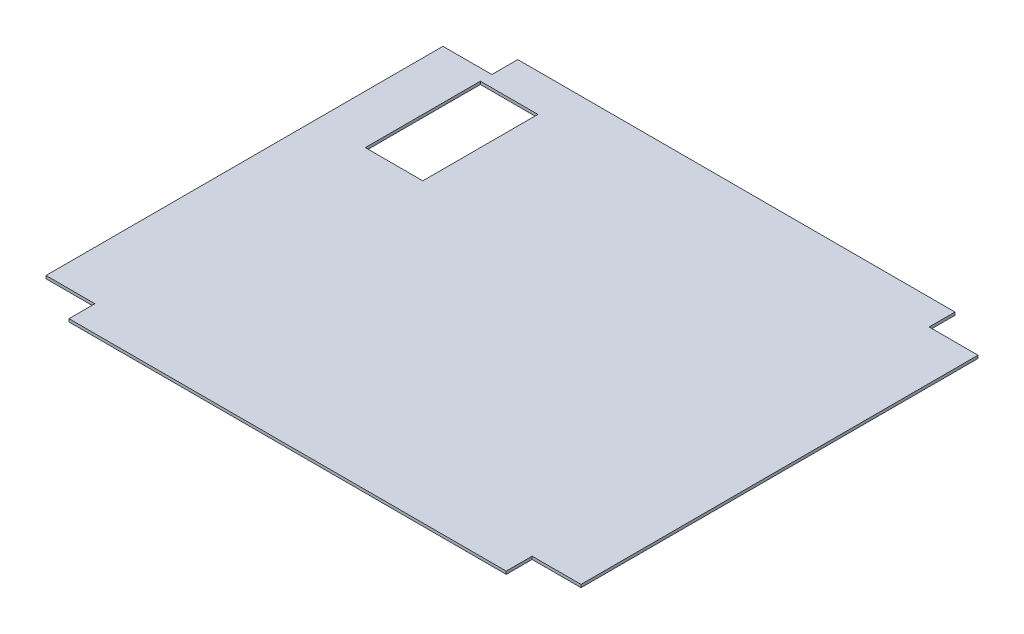
ISO-10303-21;
HEADER;
FILE_DESCRIPTION(('STEP AP214'),'2;1');
FILE_NAME('part.step','',(''),(''),'','','');
FILE_SCHEMA(('AUTOMOTIVE_DESIGN { 1 0 10303 214 1 1 1 1 }'));
ENDSEC;
DATA;
#1=APPLICATION_CONTEXT('core data for automotive mechanical design processes');
#2=APPLICATION_PROTOCOL_DEFINITION('international standard','automotive_design',2000,#1);
#3=PRODUCT_CONTEXT('',#1,'mechanical');
#4=PRODUCT('Part','Part','',(#3));
#5=PRODUCT_RELATED_PRODUCT_CATEGORY('part','',(#4));
#6=PRODUCT_DEFINITION_FORMATION('','',#4);
#7=PRODUCT_DEFINITION_CONTEXT('part definition',#1,'design');
#8=PRODUCT_DEFINITION('design','',#6,#7);
#9=PRODUCT_DEFINITION_SHAPE('','',#8);
#10=(LENGTH_UNIT() NAMED_UNIT(*) SI_UNIT(.MILLI.,.METRE.));
#11=(NAMED_UNIT(*) PLANE_ANGLE_UNIT() SI_UNIT($,.RADIAN.));
#12=(NAMED_UNIT(*) SI_UNIT($,.STERADIAN.) SOLID_ANGLE_UNIT());
#13=UNCERTAINTY_MEASURE_WITH_UNIT(LENGTH_MEASURE(1.E-05),#10,'distance_accuracy_value','');
#14=(GEOMETRIC_REPRESENTATION_CONTEXT(3) GLOBAL_UNCERTAINTY_ASSIGNED_CONTEXT((#13)) GLOBAL_UNIT_ASSIGNED_CONTEXT((#10,
#11,#12)) REPRESENTATION_CONTEXT('',''));
#15=CARTESIAN_POINT('',(0.,0.,0.));
#16=DIRECTION('',(0.,0.,1.));
#17=DIRECTION('',(1.,0.,0.));
#18=AXIS2_PLACEMENT_3D('',#15,#16,#17);
#19=CARTESIAN_POINT('',(465.,-5.,390.));
#20=DIRECTION('',(1.,0.,0.));
#21=DIRECTION('',(0.,0.,-1.));
#22=AXIS2_PLACEMENT_3D('',#19,#20,#21);
#23=PLANE('',#22);
#24=DIRECTION('',(0.,1.,0.));
#25=VECTOR('',#24,1.);
#26=CARTESIAN_POINT('',(465.,-5.,345.));
#27=LINE('',#26,#25);
#28=CARTESIAN_POINT('',(465.,-5.,345.));
#29=VERTEX_POINT('',#28);
#30=CARTESIAN_POINT('',(465.,0.,345.));
#31=VERTEX_POINT('',#30);
#32=EDGE_CURVE('E190',#29,#31,#27,.T.);
#33=ORIENTED_EDGE('',*,*,#32,.F.);
#34=DIRECTION('',(0.,0.,-1.));
#35=VECTOR('',#34,1.);
#36=CARTESIAN_POINT('',(465.,-5.,390.));
#37=LINE('',#36,#35);
#38=CARTESIAN_POINT('',(465.,-5.,-345.));
#39=VERTEX_POINT('',#38);
#40=EDGE_CURVE('E240',#29,#39,#37,.T.);
#41=ORIENTED_EDGE('',*,*,#40,.T.);
#42=DIRECTION('',(0.,1.,0.));
#43=VECTOR('',#42,1.);
#44=CARTESIAN_POINT('',(465.,-5.,-345.));
#45=LINE('',#44,#43);
#46=CARTESIAN_POINT('',(465.,0.,-345.));
#47=VERTEX_POINT('',#46);
#48=EDGE_CURVE('E214',#39,#47,#45,.T.);
#49=ORIENTED_EDGE('',*,*,#48,.T.);
#50=DIRECTION('',(0.,0.,-1.));
#51=VECTOR('',#50,1.);
#52=CARTESIAN_POINT('',(465.,0.,390.));
#53=LINE('',#52,#51);
#54=EDGE_CURVE('E236',#31,#47,#53,.T.);
#55=ORIENTED_EDGE('',*,*,#54,.F.);
#56=EDGE_LOOP('',(#33,#41,#49,#55));
#57=FACE_BOUND('',#56,.T.);
#58=ADVANCED_FACE('F17',(#57),#23,.T.);
#59=CARTESIAN_POINT('',(-465.,-5.,390.));
#60=DIRECTION('',(0.,0.,1.));
#61=DIRECTION('',(1.,0.,0.));
#62=AXIS2_PLACEMENT_3D('',#59,#60,#61);
#63=PLANE('',#62);
#64=DIRECTION('',(0.,1.,0.));
#65=VECTOR('',#64,1.);
#66=CARTESIAN_POINT('',(-380.,-5.,390.));
#67=LINE('',#66,#65);
#68=CARTESIAN_POINT('',(-380.,-5.,390.));
#69=VERTEX_POINT('',#68);
#70=CARTESIAN_POINT('',(-380.,0.,390.));
#71=VERTEX_POINT('',#70);
#72=EDGE_CURVE('E172',#69,#71,#67,.T.);
#73=ORIENTED_EDGE('',*,*,#72,.F.);
#74=DIRECTION('',(1.,0.,0.));
#75=VECTOR('',#74,1.);
#76=CARTESIAN_POINT('',(-465.,-5.,390.));
#77=LINE('',#76,#75);
#78=CARTESIAN_POINT('',(380.,-5.,390.));
#79=VERTEX_POINT('',#78);
#80=EDGE_CURVE('E11',#69,#79,#77,.T.);
#81=ORIENTED_EDGE('',*,*,#80,.T.);
#82=DIRECTION('',(0.,1.,0.));
#83=VECTOR('',#82,1.);
#84=CARTESIAN_POINT('',(380.,-5.,390.));
#85=LINE('',#84,#83);
#86=CARTESIAN_POINT('',(380.,0.,390.));
#87=VERTEX_POINT('',#86);
#88=EDGE_CURVE('E195',#79,#87,#85,.T.);
#89=ORIENTED_EDGE('',*,*,#88,.T.);
#90=DIRECTION('',(1.,0.,0.));
#91=VECTOR('',#90,1.);
#92=CARTESIAN_POINT('',(-465.,0.,390.));
#93=LINE('',#92,#91);
#94=EDGE_CURVE('E20',#71,#87,#93,.T.);
#95=ORIENTED_EDGE('',*,*,#94,.F.);
#96=EDGE_LOOP('',(#73,#81,#89,#95));
#97=FACE_BOUND('',#96,.T.);
#98=ADVANCED_FACE('F265',(#97),#63,.T.);
#99=CARTESIAN_POINT('',(-465.,-5.,390.));
#100=DIRECTION('',(-1.,0.,0.));
#101=DIRECTION('',(0.,0.,1.));
#102=AXIS2_PLACEMENT_3D('',#99,#100,#101);
#103=PLANE('',#102);
#104=DIRECTION('',(0.,1.,0.));
#105=VECTOR('',#104,1.);
#106=CARTESIAN_POINT('',(-465.,-5.,345.));
#107=LINE('',#106,#105);
#108=CARTESIAN_POINT('',(-465.,-5.,345.));
#109=VERTEX_POINT('',#108);
#110=CARTESIAN_POINT('',(-465.,0.,345.));
#111=VERTEX_POINT('',#110);
#112=EDGE_CURVE('E176',#109,#111,#107,.T.);
#113=ORIENTED_EDGE('',*,*,#112,.T.);
#114=DIRECTION('',(0.,0.,1.));
#115=VECTOR('',#114,1.);
#116=CARTESIAN_POINT('',(-465.,0.,390.));
#117=LINE('',#116,#115);
#118=CARTESIAN_POINT('',(-465.,0.,-345.));
#119=VERTEX_POINT('',#118);
#120=EDGE_CURVE('E248',#119,#111,#117,.T.);
#121=ORIENTED_EDGE('',*,*,#120,.F.);
#122=DIRECTION('',(0.,1.,0.));
#123=VECTOR('',#122,1.);
#124=CARTESIAN_POINT('',(-465.,-5.,-345.));
#125=LINE('',#124,#123);
#126=CARTESIAN_POINT('',(-465.,-5.,-345.));
#127=VERTEX_POINT('',#126);
#128=EDGE_CURVE('E228',#127,#119,#125,.T.);
#129=ORIENTED_EDGE('',*,*,#128,.F.);
#130=DIRECTION('',(0.,0.,1.));
#131=VECTOR('',#130,1.);
#132=CARTESIAN_POINT('',(-465.,-5.,390.));
#133=LINE('',#132,#131);
#134=EDGE_CURVE('E25',#127,#109,#133,.T.);
#135=ORIENTED_EDGE('',*,*,#134,.T.);
#136=EDGE_LOOP('',(#113,#121,#129,#135));
#137=FACE_BOUND('',#136,.T.);
#138=ADVANCED_FACE('F296',(#137),#103,.T.);
#139=CARTESIAN_POINT('',(-465.,-5.,-390.));
#140=DIRECTION('',(0.,0.,-1.));
#141=DIRECTION('',(-1.,0.,0.));
#142=AXIS2_PLACEMENT_3D('',#139,#140,#141);
#143=PLANE('',#142);
#144=DIRECTION('',(0.,1.,0.));
#145=VECTOR('',#144,1.);
#146=CARTESIAN_POINT('',(380.,-5.,-390.));
#147=LINE('',#146,#145);
#148=CARTESIAN_POINT('',(380.,-5.,-390.));
#149=VERTEX_POINT('',#148);
#150=CARTESIAN_POINT('',(380.,0.,-390.));
#151=VERTEX_POINT('',#150);
#152=EDGE_CURVE('E209',#149,#151,#147,.T.);
#153=ORIENTED_EDGE('',*,*,#152,.F.);
#154=DIRECTION('',(-1.,0.,0.));
#155=VECTOR('',#154,1.);
#156=CARTESIAN_POINT('',(-465.,-5.,-390.));
#157=LINE('',#156,#155);
#158=CARTESIAN_POINT('',(-380.,-5.,-390.));
#159=VERTEX_POINT('',#158);
#160=EDGE_CURVE('E242',#149,#159,#157,.T.);
#161=ORIENTED_EDGE('',*,*,#160,.T.);
#162=DIRECTION('',(0.,1.,0.));
#163=VECTOR('',#162,1.);
#164=CARTESIAN_POINT('',(-380.,-5.,-390.));
#165=LINE('',#164,#163);
#166=CARTESIAN_POINT('',(-380.,0.,-390.));
#167=VERTEX_POINT('',#166);
#168=EDGE_CURVE('E233',#159,#167,#165,.T.);
#169=ORIENTED_EDGE('',*,*,#168,.T.);
#170=DIRECTION('',(-1.,0.,0.));
#171=VECTOR('',#170,1.);
#172=CARTESIAN_POINT('',(-465.,0.,-390.));
#173=LINE('',#172,#171);
#174=EDGE_CURVE('E247',#151,#167,#173,.T.);
#175=ORIENTED_EDGE('',*,*,#174,.F.);
#176=EDGE_LOOP('',(#153,#161,#169,#175));
#177=FACE_BOUND('',#176,.T.);
#178=ADVANCED_FACE('F285',(#177),#143,.T.);
#179=CARTESIAN_POINT('',(0.,-5.,0.));
#180=DIRECTION('',(0.,-1.,0.));
#181=DIRECTION('',(0.,0.,-1.));
#182=AXIS2_PLACEMENT_3D('',#179,#180,#181);
#183=PLANE('',#182);
#184=DIRECTION('',(1.,0.,0.));
#185=VECTOR('',#184,1.);
#186=CARTESIAN_POINT('',(-380.,-5.,-125.));
#187=LINE('',#186,#185);
#188=CARTESIAN_POINT('',(-380.,-5.,-125.));
#189=VERTEX_POINT('',#188);
#190=CARTESIAN_POINT('',(-280.,-5.,-125.));
#191=VERTEX_POINT('',#190);
#192=EDGE_CURVE('E132',#189,#191,#187,.T.);
#193=ORIENTED_EDGE('',*,*,#192,.T.);
#194=DIRECTION('',(0.,0.,-1.));
#195=VECTOR('',#194,1.);
#196=CARTESIAN_POINT('',(-280.,-5.,-125.));
#197=LINE('',#196,#195);
#198=CARTESIAN_POINT('',(-280.,-5.,-325.));
#199=VERTEX_POINT('',#198);
#200=EDGE_CURVE('E138',#191,#199,#197,.T.);
#201=ORIENTED_EDGE('',*,*,#200,.T.);
#202=DIRECTION('',(1.,0.,0.));
#203=VECTOR('',#202,1.);
#204=CARTESIAN_POINT('',(-380.,-5.,-325.));
#205=LINE('',#204,#203);
#206=CARTESIAN_POINT('',(-380.,-5.,-325.));
#207=VERTEX_POINT('',#206);
#208=EDGE_CURVE('E142',#207,#199,#205,.T.);
#209=ORIENTED_EDGE('',*,*,#208,.F.);
#210=DIRECTION('',(0.,0.,-1.));
#211=VECTOR('',#210,1.);
#212=CARTESIAN_POINT('',(-380.,-5.,-125.));
#213=LINE('',#212,#211);
#214=EDGE_CURVE('E135',#189,#207,#213,.T.);
#215=ORIENTED_EDGE('',*,*,#214,.F.);
#216=EDGE_LOOP('',(#193,#201,#209,#215));
#217=FACE_BOUND('',#216,.T.);
#218=DIRECTION('',(-1.,0.,0.));
#219=VECTOR('',#218,1.);
#220=CARTESIAN_POINT('',(-465.,-5.,345.));
#221=LINE('',#220,#219);
#222=CARTESIAN_POINT('',(-380.,-5.,345.));
#223=VERTEX_POINT('',#222);
#224=EDGE_CURVE('E168',#223,#109,#221,.T.);
#225=ORIENTED_EDGE('',*,*,#224,.T.);
#226=ORIENTED_EDGE('',*,*,#134,.F.);
#227=DIRECTION('',(1.,0.,0.));
#228=VECTOR('',#227,1.);
#229=CARTESIAN_POINT('',(-465.,-5.,-345.));
#230=LINE('',#229,#228);
#231=CARTESIAN_POINT('',(-380.,-5.,-345.));
#232=VERTEX_POINT('',#231);
#233=EDGE_CURVE('E221',#127,#232,#230,.T.);
#234=ORIENTED_EDGE('',*,*,#233,.T.);
#235=DIRECTION('',(0.,0.,-1.));
#236=VECTOR('',#235,1.);
#237=CARTESIAN_POINT('',(-380.,-5.,-390.));
#238=LINE('',#237,#236);
#239=EDGE_CURVE('E224',#232,#159,#238,.T.);
#240=ORIENTED_EDGE('',*,*,#239,.T.);
#241=ORIENTED_EDGE('',*,*,#160,.F.);
#242=DIRECTION('',(0.,0.,1.));
#243=VECTOR('',#242,1.);
#244=CARTESIAN_POINT('',(380.,-5.,-390.));
#245=LINE('',#244,#243);
#246=CARTESIAN_POINT('',(380.,-5.,-345.));
#247=VERTEX_POINT('',#246);
#248=EDGE_CURVE('E202',#149,#247,#245,.T.);
#249=ORIENTED_EDGE('',*,*,#248,.T.);
#250=DIRECTION('',(1.,0.,0.));
#251=VECTOR('',#250,1.);
#252=CARTESIAN_POINT('',(465.,-5.,-345.));
#253=LINE('',#252,#251);
#254=EDGE_CURVE('E205',#247,#39,#253,.T.);
#255=ORIENTED_EDGE('',*,*,#254,.T.);
#256=ORIENTED_EDGE('',*,*,#40,.F.);
#257=DIRECTION('',(-1.,0.,0.));
#258=VECTOR('',#257,1.);
#259=CARTESIAN_POINT('',(465.,-5.,345.));
#260=LINE('',#259,#258);
#261=CARTESIAN_POINT('',(380.,-5.,345.));
#262=VERTEX_POINT('',#261);
#263=EDGE_CURVE('E183',#29,#262,#260,.T.);
#264=ORIENTED_EDGE('',*,*,#263,.T.);
#265=DIRECTION('',(0.,0.,1.));
#266=VECTOR('',#265,1.);
#267=CARTESIAN_POINT('',(380.,-5.,390.));
#268=LINE('',#267,#266);
#269=EDGE_CURVE('E186',#262,#79,#268,.T.);
#270=ORIENTED_EDGE('',*,*,#269,.T.);
#271=ORIENTED_EDGE('',*,*,#80,.F.);
#272=DIRECTION('',(0.,0.,-1.));
#273=VECTOR('',#272,1.);
#274=CARTESIAN_POINT('',(-380.,-5.,390.));
#275=LINE('',#274,#273);
#276=EDGE_CURVE('E165',#69,#223,#275,.T.);
#277=ORIENTED_EDGE('',*,*,#276,.T.);
#278=EDGE_LOOP('',(#225,#226,#234,#240,#241,#249,#255,#256,#264,#270,#271,#277));
#279=FACE_BOUND('',#278,.T.);
#280=ADVANCED_FACE('F144',(#217,#279),#183,.T.);
#281=CARTESIAN_POINT('',(0.,0.,0.));
#282=DIRECTION('',(0.,-1.,0.));
#283=DIRECTION('',(0.,0.,-1.));
#284=AXIS2_PLACEMENT_3D('',#281,#282,#283);
#285=PLANE('',#284);
#286=DIRECTION('',(0.,0.,-1.));
#287=VECTOR('',#286,1.);
#288=CARTESIAN_POINT('',(-280.,0.,-125.));
#289=LINE('',#288,#287);
#290=CARTESIAN_POINT('',(-280.,0.,-125.));
#291=VERTEX_POINT('',#290);
#292=CARTESIAN_POINT('',(-280.,0.,-325.));
#293=VERTEX_POINT('',#292);
#294=EDGE_CURVE('E155',#291,#293,#289,.T.);
#295=ORIENTED_EDGE('',*,*,#294,.F.);
#296=DIRECTION('',(1.,0.,0.));
#297=VECTOR('',#296,1.);
#298=CARTESIAN_POINT('',(-380.,0.,-125.));
#299=LINE('',#298,#297);
#300=CARTESIAN_POINT('',(-380.,0.,-125.));
#301=VERTEX_POINT('',#300);
#302=EDGE_CURVE('E41',#301,#291,#299,.T.);
#303=ORIENTED_EDGE('',*,*,#302,.F.);
#304=DIRECTION('',(0.,0.,-1.));
#305=VECTOR('',#304,1.);
#306=CARTESIAN_POINT('',(-380.,0.,-125.));
#307=LINE('',#306,#305);
#308=CARTESIAN_POINT('',(-380.,0.,-325.));
#309=VERTEX_POINT('',#308);
#310=EDGE_CURVE('E146',#301,#309,#307,.T.);
#311=ORIENTED_EDGE('',*,*,#310,.T.);
#312=DIRECTION('',(1.,0.,0.));
#313=VECTOR('',#312,1.);
#314=CARTESIAN_POINT('',(-380.,0.,-325.));
#315=LINE('',#314,#313);
#316=EDGE_CURVE('E149',#309,#293,#315,.T.);
#317=ORIENTED_EDGE('',*,*,#316,.T.);
#318=EDGE_LOOP('',(#295,#303,#311,#317));
#319=FACE_BOUND('',#318,.T.);
#320=ORIENTED_EDGE('',*,*,#120,.T.);
#321=DIRECTION('',(-1.,0.,0.));
#322=VECTOR('',#321,1.);
#323=CARTESIAN_POINT('',(-465.,0.,345.));
#324=LINE('',#323,#322);
#325=CARTESIAN_POINT('',(-380.,0.,345.));
#326=VERTEX_POINT('',#325);
#327=EDGE_CURVE('E169',#326,#111,#324,.T.);
#328=ORIENTED_EDGE('',*,*,#327,.F.);
#329=DIRECTION('',(0.,0.,-1.));
#330=VECTOR('',#329,1.);
#331=CARTESIAN_POINT('',(-380.,0.,390.));
#332=LINE('',#331,#330);
#333=EDGE_CURVE('E161',#71,#326,#332,.T.);
#334=ORIENTED_EDGE('',*,*,#333,.F.);
#335=ORIENTED_EDGE('',*,*,#94,.T.);
#336=DIRECTION('',(0.,0.,1.));
#337=VECTOR('',#336,1.);
#338=CARTESIAN_POINT('',(380.,0.,390.));
#339=LINE('',#338,#337);
#340=CARTESIAN_POINT('',(380.,0.,345.));
#341=VERTEX_POINT('',#340);
#342=EDGE_CURVE('E187',#341,#87,#339,.T.);
#343=ORIENTED_EDGE('',*,*,#342,.F.);
#344=DIRECTION('',(-1.,0.,0.));
#345=VECTOR('',#344,1.);
#346=CARTESIAN_POINT('',(465.,0.,345.));
#347=LINE('',#346,#345);
#348=EDGE_CURVE('E179',#31,#341,#347,.T.);
#349=ORIENTED_EDGE('',*,*,#348,.F.);
#350=ORIENTED_EDGE('',*,*,#54,.T.);
#351=DIRECTION('',(1.,0.,0.));
#352=VECTOR('',#351,1.);
#353=CARTESIAN_POINT('',(465.,0.,-345.));
#354=LINE('',#353,#352);
#355=CARTESIAN_POINT('',(380.,0.,-345.));
#356=VERTEX_POINT('',#355);
#357=EDGE_CURVE('E206',#356,#47,#354,.T.);
#358=ORIENTED_EDGE('',*,*,#357,.F.);
#359=DIRECTION('',(0.,0.,1.));
#360=VECTOR('',#359,1.);
#361=CARTESIAN_POINT('',(380.,0.,-390.));
#362=LINE('',#361,#360);
#363=EDGE_CURVE('E198',#151,#356,#362,.T.);
#364=ORIENTED_EDGE('',*,*,#363,.F.);
#365=ORIENTED_EDGE('',*,*,#174,.T.);
#366=DIRECTION('',(0.,0.,-1.));
#367=VECTOR('',#366,1.);
#368=CARTESIAN_POINT('',(-380.,0.,-390.));
#369=LINE('',#368,#367);
#370=CARTESIAN_POINT('',(-380.,0.,-345.));
#371=VERTEX_POINT('',#370);
#372=EDGE_CURVE('E225',#371,#167,#369,.T.);
#373=ORIENTED_EDGE('',*,*,#372,.F.);
#374=DIRECTION('',(1.,0.,0.));
#375=VECTOR('',#374,1.);
#376=CARTESIAN_POINT('',(-465.,0.,-345.));
#377=LINE('',#376,#375);
#378=EDGE_CURVE('E217',#119,#371,#377,.T.);
#379=ORIENTED_EDGE('',*,*,#378,.F.);
#380=EDGE_LOOP('',(#320,#328,#334,#335,#343,#349,#350,#358,#364,#365,#373,#379));
#381=FACE_BOUND('',#380,.T.);
#382=ADVANCED_FACE('F257',(#319,#381),#285,.F.);
#383=CARTESIAN_POINT('',(-380.,-5.,-390.));
#384=DIRECTION('',(1.,0.,0.));
#385=DIRECTION('',(0.,0.,-1.));
#386=AXIS2_PLACEMENT_3D('',#383,#384,#385);
#387=PLANE('',#386);
#388=ORIENTED_EDGE('',*,*,#372,.T.);
#389=ORIENTED_EDGE('',*,*,#168,.F.);
#390=ORIENTED_EDGE('',*,*,#239,.F.);
#391=DIRECTION('',(0.,1.,0.));
#392=VECTOR('',#391,1.);
#393=CARTESIAN_POINT('',(-380.,-5.,-345.));
#394=LINE('',#393,#392);
#395=EDGE_CURVE('E237',#232,#371,#394,.T.);
#396=ORIENTED_EDGE('',*,*,#395,.T.);
#397=EDGE_LOOP('',(#388,#389,#390,#396));
#398=FACE_BOUND('',#397,.T.);
#399=ADVANCED_FACE('F290',(#398),#387,.F.);
#400=CARTESIAN_POINT('',(-465.,-5.,-345.));
#401=DIRECTION('',(0.,0.,1.));
#402=DIRECTION('',(1.,0.,0.));
#403=AXIS2_PLACEMENT_3D('',#400,#401,#402);
#404=PLANE('',#403);
#405=ORIENTED_EDGE('',*,*,#378,.T.);
#406=ORIENTED_EDGE('',*,*,#395,.F.);
#407=ORIENTED_EDGE('',*,*,#233,.F.);
#408=ORIENTED_EDGE('',*,*,#128,.T.);
#409=EDGE_LOOP('',(#405,#406,#407,#408));
#410=FACE_BOUND('',#409,.T.);
#411=ADVANCED_FACE('F294',(#410),#404,.F.);
#412=CARTESIAN_POINT('',(465.,-5.,-345.));
#413=DIRECTION('',(0.,0.,1.));
#414=DIRECTION('',(1.,0.,0.));
#415=AXIS2_PLACEMENT_3D('',#412,#413,#414);
#416=PLANE('',#415);
#417=ORIENTED_EDGE('',*,*,#357,.T.);
#418=ORIENTED_EDGE('',*,*,#48,.F.);
#419=ORIENTED_EDGE('',*,*,#254,.F.);
#420=DIRECTION('',(0.,1.,0.));
#421=VECTOR('',#420,1.);
#422=CARTESIAN_POINT('',(380.,-5.,-345.));
#423=LINE('',#422,#421);
#424=EDGE_CURVE('E218',#247,#356,#423,.T.);
#425=ORIENTED_EDGE('',*,*,#424,.T.);
#426=EDGE_LOOP('',(#417,#418,#419,#425));
#427=FACE_BOUND('',#426,.T.);
#428=ADVANCED_FACE('F277',(#427),#416,.F.);
#429=CARTESIAN_POINT('',(380.,-5.,-390.));
#430=DIRECTION('',(-1.,0.,0.));
#431=DIRECTION('',(0.,0.,1.));
#432=AXIS2_PLACEMENT_3D('',#429,#430,#431);
#433=PLANE('',#432);
#434=ORIENTED_EDGE('',*,*,#363,.T.);
#435=ORIENTED_EDGE('',*,*,#424,.F.);
#436=ORIENTED_EDGE('',*,*,#248,.F.);
#437=ORIENTED_EDGE('',*,*,#152,.T.);
#438=EDGE_LOOP('',(#434,#435,#436,#437));
#439=FACE_BOUND('',#438,.T.);
#440=ADVANCED_FACE('F280',(#439),#433,.F.);
#441=CARTESIAN_POINT('',(380.,-5.,390.));
#442=DIRECTION('',(-1.,0.,0.));
#443=DIRECTION('',(0.,0.,1.));
#444=AXIS2_PLACEMENT_3D('',#441,#442,#443);
#445=PLANE('',#444);
#446=ORIENTED_EDGE('',*,*,#342,.T.);
#447=ORIENTED_EDGE('',*,*,#88,.F.);
#448=ORIENTED_EDGE('',*,*,#269,.F.);
#449=DIRECTION('',(0.,1.,0.));
#450=VECTOR('',#449,1.);
#451=CARTESIAN_POINT('',(380.,-5.,345.));
#452=LINE('',#451,#450);
#453=EDGE_CURVE('E199',#262,#341,#452,.T.);
#454=ORIENTED_EDGE('',*,*,#453,.T.);
#455=EDGE_LOOP('',(#446,#447,#448,#454));
#456=FACE_BOUND('',#455,.T.);
#457=ADVANCED_FACE('F263',(#456),#445,.F.);
#458=CARTESIAN_POINT('',(465.,-5.,345.));
#459=DIRECTION('',(0.,0.,-1.));
#460=DIRECTION('',(-1.,0.,0.));
#461=AXIS2_PLACEMENT_3D('',#458,#459,#460);
#462=PLANE('',#461);
#463=ORIENTED_EDGE('',*,*,#348,.T.);
#464=ORIENTED_EDGE('',*,*,#453,.F.);
#465=ORIENTED_EDGE('',*,*,#263,.F.);
#466=ORIENTED_EDGE('',*,*,#32,.T.);
#467=EDGE_LOOP('',(#463,#464,#465,#466));
#468=FACE_BOUND('',#467,.T.);
#469=ADVANCED_FACE('F270',(#468),#462,.F.);
#470=CARTESIAN_POINT('',(-465.,-5.,345.));
#471=DIRECTION('',(0.,0.,-1.));
#472=DIRECTION('',(-1.,0.,0.));
#473=AXIS2_PLACEMENT_3D('',#470,#471,#472);
#474=PLANE('',#473);
#475=ORIENTED_EDGE('',*,*,#327,.T.);
#476=ORIENTED_EDGE('',*,*,#112,.F.);
#477=ORIENTED_EDGE('',*,*,#224,.F.);
#478=DIRECTION('',(0.,1.,0.));
#479=VECTOR('',#478,1.);
#480=CARTESIAN_POINT('',(-380.,-5.,345.));
#481=LINE('',#480,#479);
#482=EDGE_CURVE('E180',#223,#326,#481,.T.);
#483=ORIENTED_EDGE('',*,*,#482,.T.);
#484=EDGE_LOOP('',(#475,#476,#477,#483));
#485=FACE_BOUND('',#484,.T.);
#486=ADVANCED_FACE('F299',(#485),#474,.F.);
#487=CARTESIAN_POINT('',(-380.,-5.,390.));
#488=DIRECTION('',(1.,0.,0.));
#489=DIRECTION('',(0.,0.,-1.));
#490=AXIS2_PLACEMENT_3D('',#487,#488,#489);
#491=PLANE('',#490);
#492=ORIENTED_EDGE('',*,*,#333,.T.);
#493=ORIENTED_EDGE('',*,*,#482,.F.);
#494=ORIENTED_EDGE('',*,*,#276,.F.);
#495=ORIENTED_EDGE('',*,*,#72,.T.);
#496=EDGE_LOOP('',(#492,#493,#494,#495));
#497=FACE_BOUND('',#496,.T.);
#498=ADVANCED_FACE('F301',(#497),#491,.F.);
#499=CARTESIAN_POINT('',(-380.,-5.,-125.));
#500=DIRECTION('',(0.,0.,1.));
#501=DIRECTION('',(1.,0.,0.));
#502=AXIS2_PLACEMENT_3D('',#499,#500,#501);
#503=PLANE('',#502);
#504=ORIENTED_EDGE('',*,*,#302,.T.);
#505=DIRECTION('',(0.,1.,0.));
#506=VECTOR('',#505,1.);
#507=CARTESIAN_POINT('',(-280.,-5.,-125.));
#508=LINE('',#507,#506);
#509=EDGE_CURVE('E129',#191,#291,#508,.T.);
#510=ORIENTED_EDGE('',*,*,#509,.F.);
#511=ORIENTED_EDGE('',*,*,#192,.F.);
#512=DIRECTION('',(0.,1.,0.));
#513=VECTOR('',#512,1.);
#514=CARTESIAN_POINT('',(-380.,-5.,-125.));
#515=LINE('',#514,#513);
#516=EDGE_CURVE('E159',#189,#301,#515,.T.);
#517=ORIENTED_EDGE('',*,*,#516,.T.);
#518=EDGE_LOOP('',(#504,#510,#511,#517));
#519=FACE_BOUND('',#518,.T.);
#520=ADVANCED_FACE('F130',(#519),#503,.F.);
#521=CARTESIAN_POINT('',(-380.,-5.,-125.));
#522=DIRECTION('',(1.,0.,0.));
#523=DIRECTION('',(0.,0.,-1.));
#524=AXIS2_PLACEMENT_3D('',#521,#522,#523);
#525=PLANE('',#524);
#526=ORIENTED_EDGE('',*,*,#310,.F.);
#527=ORIENTED_EDGE('',*,*,#516,.F.);
#528=ORIENTED_EDGE('',*,*,#214,.T.);
#529=DIRECTION('',(0.,1.,0.));
#530=VECTOR('',#529,1.);
#531=CARTESIAN_POINT('',(-380.,-5.,-325.));
#532=LINE('',#531,#530);
#533=EDGE_CURVE('E162',#207,#309,#532,.T.);
#534=ORIENTED_EDGE('',*,*,#533,.T.);
#535=EDGE_LOOP('',(#526,#527,#528,#534));
#536=FACE_BOUND('',#535,.T.);
#537=ADVANCED_FACE('F310',(#536),#525,.T.);
#538=CARTESIAN_POINT('',(-380.,-5.,-325.));
#539=DIRECTION('',(0.,0.,1.));
#540=DIRECTION('',(1.,0.,0.));
#541=AXIS2_PLACEMENT_3D('',#538,#539,#540);
#542=PLANE('',#541);
#543=ORIENTED_EDGE('',*,*,#316,.F.);
#544=ORIENTED_EDGE('',*,*,#533,.F.);
#545=ORIENTED_EDGE('',*,*,#208,.T.);
#546=DIRECTION('',(0.,1.,0.));
#547=VECTOR('',#546,1.);
#548=CARTESIAN_POINT('',(-280.,-5.,-325.));
#549=LINE('',#548,#547);
#550=EDGE_CURVE('E33',#199,#293,#549,.T.);
#551=ORIENTED_EDGE('',*,*,#550,.T.);
#552=EDGE_LOOP('',(#543,#544,#545,#551));
#553=FACE_BOUND('',#552,.T.);
#554=ADVANCED_FACE('F387',(#553),#542,.T.);
#555=CARTESIAN_POINT('',(-280.,-5.,-125.));
#556=DIRECTION('',(1.,0.,0.));
#557=DIRECTION('',(0.,0.,-1.));
#558=AXIS2_PLACEMENT_3D('',#555,#556,#557);
#559=PLANE('',#558);
#560=ORIENTED_EDGE('',*,*,#294,.T.);
#561=ORIENTED_EDGE('',*,*,#550,.F.);
#562=ORIENTED_EDGE('',*,*,#200,.F.);
#563=ORIENTED_EDGE('',*,*,#509,.T.);
#564=EDGE_LOOP('',(#560,#561,#562,#563));
#565=FACE_BOUND('',#564,.T.);
#566=ADVANCED_FACE('F139',(#565),#559,.F.);
#567=CLOSED_SHELL('',(#58,#98,#138,#178,#280,#382,#399,#411,#428,#440,#457,#469,#486,#498,#520,
#537,#554,#566));
#568=MANIFOLD_SOLID_BREP('B1',#567);
#569=ADVANCED_BREP_SHAPE_REPRESENTATION('',(#18,#568),#14);
#570=SHAPE_DEFINITION_REPRESENTATION(#9,#569);
ENDSEC;
END-ISO-10303-21;
